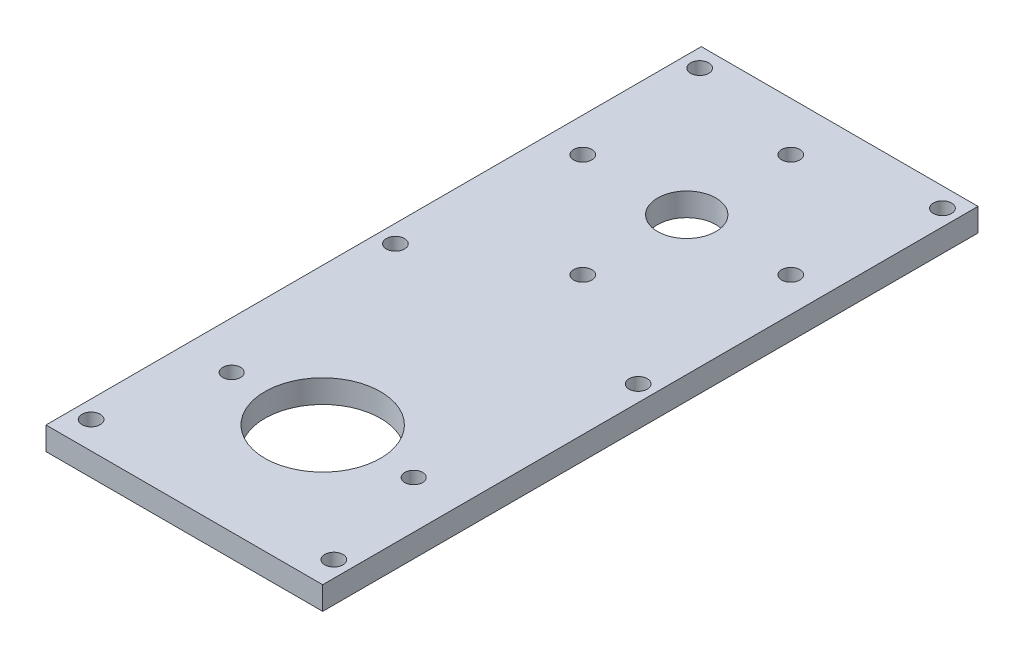
ISO-10303-21;
HEADER;
FILE_DESCRIPTION(('STEP AP214'),'2;1');
FILE_NAME('part.step','',(''),(''),'','','');
FILE_SCHEMA(('AUTOMOTIVE_DESIGN { 1 0 10303 214 1 1 1 1 }'));
ENDSEC;
DATA;
#1=APPLICATION_CONTEXT('core data for automotive mechanical design processes');
#2=APPLICATION_PROTOCOL_DEFINITION('international standard','automotive_design',2000,#1);
#3=PRODUCT_CONTEXT('',#1,'mechanical');
#4=PRODUCT('Part','Part','',(#3));
#5=PRODUCT_RELATED_PRODUCT_CATEGORY('part','',(#4));
#6=PRODUCT_DEFINITION_FORMATION('','',#4);
#7=PRODUCT_DEFINITION_CONTEXT('part definition',#1,'design');
#8=PRODUCT_DEFINITION('design','',#6,#7);
#9=PRODUCT_DEFINITION_SHAPE('','',#8);
#10=(LENGTH_UNIT() NAMED_UNIT(*) SI_UNIT(.MILLI.,.METRE.));
#11=(NAMED_UNIT(*) PLANE_ANGLE_UNIT() SI_UNIT($,.RADIAN.));
#12=(NAMED_UNIT(*) SI_UNIT($,.STERADIAN.) SOLID_ANGLE_UNIT());
#13=UNCERTAINTY_MEASURE_WITH_UNIT(LENGTH_MEASURE(1.E-05),#10,'distance_accuracy_value','');
#14=(GEOMETRIC_REPRESENTATION_CONTEXT(3) GLOBAL_UNCERTAINTY_ASSIGNED_CONTEXT((#13)) GLOBAL_UNIT_ASSIGNED_CONTEXT((#10,
#11,#12)) REPRESENTATION_CONTEXT('',''));
#15=CARTESIAN_POINT('',(0.,0.,0.));
#16=DIRECTION('',(0.,0.,1.));
#17=DIRECTION('',(1.,0.,0.));
#18=AXIS2_PLACEMENT_3D('',#15,#16,#17);
#19=CARTESIAN_POINT('',(-19.,3.175,0.));
#20=DIRECTION('',(1.,0.,0.));
#21=DIRECTION('',(0.,0.,-1.));
#22=AXIS2_PLACEMENT_3D('',#19,#20,#21);
#23=PLANE('',#22);
#24=DIRECTION('',(0.,0.,1.));
#25=VECTOR('',#24,1.);
#26=CARTESIAN_POINT('',(-19.,0.,0.));
#27=LINE('',#26,#25);
#28=CARTESIAN_POINT('',(-19.,0.,-71.));
#29=VERTEX_POINT('',#28);
#30=CARTESIAN_POINT('',(-19.,0.,19.));
#31=VERTEX_POINT('',#30);
#32=EDGE_CURVE('E144',#29,#31,#27,.T.);
#33=ORIENTED_EDGE('',*,*,#32,.T.);
#34=DIRECTION('',(0.,-1.,0.));
#35=VECTOR('',#34,1.);
#36=CARTESIAN_POINT('',(-19.,3.175,19.));
#37=LINE('',#36,#35);
#38=CARTESIAN_POINT('',(-19.,3.175,19.));
#39=VERTEX_POINT('',#38);
#40=EDGE_CURVE('E11',#39,#31,#37,.T.);
#41=ORIENTED_EDGE('',*,*,#40,.F.);
#42=DIRECTION('',(0.,0.,1.));
#43=VECTOR('',#42,1.);
#44=CARTESIAN_POINT('',(-19.,3.175,0.));
#45=LINE('',#44,#43);
#46=CARTESIAN_POINT('',(-19.,3.175,-71.));
#47=VERTEX_POINT('',#46);
#48=EDGE_CURVE('E90',#47,#39,#45,.T.);
#49=ORIENTED_EDGE('',*,*,#48,.F.);
#50=DIRECTION('',(0.,-1.,0.));
#51=VECTOR('',#50,1.);
#52=CARTESIAN_POINT('',(-19.,3.175,-71.));
#53=LINE('',#52,#51);
#54=EDGE_CURVE('E107',#47,#29,#53,.T.);
#55=ORIENTED_EDGE('',*,*,#54,.T.);
#56=EDGE_LOOP('',(#33,#41,#49,#55));
#57=FACE_BOUND('',#56,.T.);
#58=ADVANCED_FACE('F37',(#57),#23,.F.);
#59=CARTESIAN_POINT('',(0.,3.175,19.));
#60=DIRECTION('',(0.,0.,-1.));
#61=DIRECTION('',(-1.,0.,0.));
#62=AXIS2_PLACEMENT_3D('',#59,#60,#61);
#63=PLANE('',#62);
#64=DIRECTION('',(1.,0.,0.));
#65=VECTOR('',#64,1.);
#66=CARTESIAN_POINT('',(0.,0.,19.));
#67=LINE('',#66,#65);
#68=CARTESIAN_POINT('',(19.,0.,19.));
#69=VERTEX_POINT('',#68);
#70=EDGE_CURVE('E94',#31,#69,#67,.T.);
#71=ORIENTED_EDGE('',*,*,#70,.T.);
#72=DIRECTION('',(0.,-1.,0.));
#73=VECTOR('',#72,1.);
#74=CARTESIAN_POINT('',(19.,3.175,19.));
#75=LINE('',#74,#73);
#76=CARTESIAN_POINT('',(19.,3.175,19.));
#77=VERTEX_POINT('',#76);
#78=EDGE_CURVE('E46',#77,#69,#75,.T.);
#79=ORIENTED_EDGE('',*,*,#78,.F.);
#80=DIRECTION('',(1.,0.,0.));
#81=VECTOR('',#80,1.);
#82=CARTESIAN_POINT('',(0.,3.175,19.));
#83=LINE('',#82,#81);
#84=EDGE_CURVE('E84',#39,#77,#83,.T.);
#85=ORIENTED_EDGE('',*,*,#84,.F.);
#86=ORIENTED_EDGE('',*,*,#40,.T.);
#87=EDGE_LOOP('',(#71,#79,#85,#86));
#88=FACE_BOUND('',#87,.T.);
#89=ADVANCED_FACE('F93',(#88),#63,.F.);
#90=CARTESIAN_POINT('',(19.,3.175,0.));
#91=DIRECTION('',(-1.,0.,0.));
#92=DIRECTION('',(0.,0.,1.));
#93=AXIS2_PLACEMENT_3D('',#90,#91,#92);
#94=PLANE('',#93);
#95=DIRECTION('',(0.,0.,-1.));
#96=VECTOR('',#95,1.);
#97=CARTESIAN_POINT('',(19.,0.,0.));
#98=LINE('',#97,#96);
#99=CARTESIAN_POINT('',(19.,0.,-71.));
#100=VERTEX_POINT('',#99);
#101=EDGE_CURVE('E71',#69,#100,#98,.T.);
#102=ORIENTED_EDGE('',*,*,#101,.T.);
#103=DIRECTION('',(0.,-1.,0.));
#104=VECTOR('',#103,1.);
#105=CARTESIAN_POINT('',(19.,3.175,-71.));
#106=LINE('',#105,#104);
#107=CARTESIAN_POINT('',(19.,3.175,-71.));
#108=VERTEX_POINT('',#107);
#109=EDGE_CURVE('E95',#108,#100,#106,.T.);
#110=ORIENTED_EDGE('',*,*,#109,.F.);
#111=DIRECTION('',(0.,0.,-1.));
#112=VECTOR('',#111,1.);
#113=CARTESIAN_POINT('',(19.,3.175,0.));
#114=LINE('',#113,#112);
#115=EDGE_CURVE('E88',#77,#108,#114,.T.);
#116=ORIENTED_EDGE('',*,*,#115,.F.);
#117=ORIENTED_EDGE('',*,*,#78,.T.);
#118=EDGE_LOOP('',(#102,#110,#116,#117));
#119=FACE_BOUND('',#118,.T.);
#120=ADVANCED_FACE('F96',(#119),#94,.F.);
#121=CARTESIAN_POINT('',(-12.5,3.175,0.));
#122=DIRECTION('',(0.,-1.,0.));
#123=DIRECTION('',(0.,0.,-1.));
#124=AXIS2_PLACEMENT_3D('',#121,#122,#123);
#125=CYLINDRICAL_SURFACE('',#124,1.22);
#126=CARTESIAN_POINT('',(-12.5,3.175,0.));
#127=DIRECTION('',(0.,1.,0.));
#128=DIRECTION('',(0.,0.,1.));
#129=AXIS2_PLACEMENT_3D('',#126,#127,#128);
#130=CIRCLE('',#129,1.22);
#131=CARTESIAN_POINT('',(-12.5,3.175,1.22));
#132=VERTEX_POINT('',#131);
#133=EDGE_CURVE('E98',#132,#132,#130,.T.);
#134=ORIENTED_EDGE('',*,*,#133,.T.);
#135=EDGE_LOOP('',(#134));
#136=FACE_BOUND('',#135,.T.);
#137=CARTESIAN_POINT('',(-12.5,0.,0.));
#138=DIRECTION('',(0.,1.,0.));
#139=DIRECTION('',(0.,0.,1.));
#140=AXIS2_PLACEMENT_3D('',#137,#138,#139);
#141=CIRCLE('',#140,1.22);
#142=CARTESIAN_POINT('',(-12.5,0.,1.22));
#143=VERTEX_POINT('',#142);
#144=EDGE_CURVE('E150',#143,#143,#141,.T.);
#145=ORIENTED_EDGE('',*,*,#144,.F.);
#146=EDGE_LOOP('',(#145));
#147=FACE_BOUND('',#146,.T.);
#148=ADVANCED_FACE('F328',(#136,#147),#125,.F.);
#149=CARTESIAN_POINT('',(0.,3.175,-71.));
#150=DIRECTION('',(0.,0.,1.));
#151=DIRECTION('',(1.,0.,0.));
#152=AXIS2_PLACEMENT_3D('',#149,#150,#151);
#153=PLANE('',#152);
#154=DIRECTION('',(-1.,0.,0.));
#155=VECTOR('',#154,1.);
#156=CARTESIAN_POINT('',(0.,0.,-71.));
#157=LINE('',#156,#155);
#158=EDGE_CURVE('E77',#100,#29,#157,.T.);
#159=ORIENTED_EDGE('',*,*,#158,.T.);
#160=ORIENTED_EDGE('',*,*,#54,.F.);
#161=DIRECTION('',(-1.,0.,0.));
#162=VECTOR('',#161,1.);
#163=CARTESIAN_POINT('',(0.,3.175,-71.));
#164=LINE('',#163,#162);
#165=EDGE_CURVE('E54',#108,#47,#164,.T.);
#166=ORIENTED_EDGE('',*,*,#165,.F.);
#167=ORIENTED_EDGE('',*,*,#109,.T.);
#168=EDGE_LOOP('',(#159,#160,#166,#167));
#169=FACE_BOUND('',#168,.T.);
#170=ADVANCED_FACE('F158',(#169),#153,.F.);
#171=CARTESIAN_POINT('',(12.5,3.175,0.));
#172=DIRECTION('',(0.,-1.,0.));
#173=DIRECTION('',(0.,0.,-1.));
#174=AXIS2_PLACEMENT_3D('',#171,#172,#173);
#175=CYLINDRICAL_SURFACE('',#174,1.22);
#176=CARTESIAN_POINT('',(12.5,3.175,0.));
#177=DIRECTION('',(0.,1.,0.));
#178=DIRECTION('',(0.,0.,1.));
#179=AXIS2_PLACEMENT_3D('',#176,#177,#178);
#180=CIRCLE('',#179,1.22);
#181=CARTESIAN_POINT('',(12.5,3.175,1.22));
#182=VERTEX_POINT('',#181);
#183=EDGE_CURVE('E164',#182,#182,#180,.T.);
#184=ORIENTED_EDGE('',*,*,#183,.T.);
#185=EDGE_LOOP('',(#184));
#186=FACE_BOUND('',#185,.T.);
#187=CARTESIAN_POINT('',(12.5,0.,0.));
#188=DIRECTION('',(0.,1.,0.));
#189=DIRECTION('',(0.,0.,1.));
#190=AXIS2_PLACEMENT_3D('',#187,#188,#189);
#191=CIRCLE('',#190,1.22);
#192=CARTESIAN_POINT('',(12.5,0.,1.22));
#193=VERTEX_POINT('',#192);
#194=EDGE_CURVE('E141',#193,#193,#191,.T.);
#195=ORIENTED_EDGE('',*,*,#194,.F.);
#196=EDGE_LOOP('',(#195));
#197=FACE_BOUND('',#196,.T.);
#198=ADVANCED_FACE('F229',(#186,#197),#175,.F.);
#199=CARTESIAN_POINT('',(-14.2875,3.175,-50.));
#200=DIRECTION('',(0.,-1.,0.));
#201=DIRECTION('',(0.,0.,-1.));
#202=AXIS2_PLACEMENT_3D('',#199,#200,#201);
#203=CYLINDRICAL_SURFACE('',#202,1.25);
#204=CARTESIAN_POINT('',(-14.2875,3.175,-50.));
#205=DIRECTION('',(0.,1.,0.));
#206=DIRECTION('',(0.,0.,1.));
#207=AXIS2_PLACEMENT_3D('',#204,#205,#206);
#208=CIRCLE('',#207,1.25);
#209=CARTESIAN_POINT('',(-14.2875,3.175,-48.75));
#210=VERTEX_POINT('',#209);
#211=EDGE_CURVE('E166',#210,#210,#208,.T.);
#212=ORIENTED_EDGE('',*,*,#211,.T.);
#213=EDGE_LOOP('',(#212));
#214=FACE_BOUND('',#213,.T.);
#215=CARTESIAN_POINT('',(-14.2875,0.,-50.));
#216=DIRECTION('',(0.,1.,0.));
#217=DIRECTION('',(0.,0.,1.));
#218=AXIS2_PLACEMENT_3D('',#215,#216,#217);
#219=CIRCLE('',#218,1.25);
#220=CARTESIAN_POINT('',(-14.2875,0.,-48.75));
#221=VERTEX_POINT('',#220);
#222=EDGE_CURVE('E138',#221,#221,#219,.T.);
#223=ORIENTED_EDGE('',*,*,#222,.F.);
#224=EDGE_LOOP('',(#223));
#225=FACE_BOUND('',#224,.T.);
#226=ADVANCED_FACE('F232',(#214,#225),#203,.F.);
#227=CARTESIAN_POINT('',(16.7853152068389,3.175,15.2488594338536));
#228=DIRECTION('',(0.,-1.,0.));
#229=DIRECTION('',(0.,0.,-1.));
#230=AXIS2_PLACEMENT_3D('',#227,#228,#229);
#231=CYLINDRICAL_SURFACE('',#230,1.25);
#232=CARTESIAN_POINT('',(16.7853152068389,3.175,15.2488594338536));
#233=DIRECTION('',(0.,1.,0.));
#234=DIRECTION('',(0.,0.,1.));
#235=AXIS2_PLACEMENT_3D('',#232,#233,#234);
#236=CIRCLE('',#235,1.25);
#237=CARTESIAN_POINT('',(16.7853152068389,3.175,16.4988594338536));
#238=VERTEX_POINT('',#237);
#239=EDGE_CURVE('E171',#238,#238,#236,.T.);
#240=ORIENTED_EDGE('',*,*,#239,.T.);
#241=EDGE_LOOP('',(#240));
#242=FACE_BOUND('',#241,.T.);
#243=CARTESIAN_POINT('',(16.7853152068389,0.,15.2488594338536));
#244=DIRECTION('',(0.,1.,0.));
#245=DIRECTION('',(0.,0.,1.));
#246=AXIS2_PLACEMENT_3D('',#243,#244,#245);
#247=CIRCLE('',#246,1.25);
#248=CARTESIAN_POINT('',(16.7853152068389,0.,16.4988594338536));
#249=VERTEX_POINT('',#248);
#250=EDGE_CURVE('E135',#249,#249,#247,.T.);
#251=ORIENTED_EDGE('',*,*,#250,.F.);
#252=EDGE_LOOP('',(#251));
#253=FACE_BOUND('',#252,.T.);
#254=ADVANCED_FACE('F253',(#242,#253),#231,.F.);
#255=CARTESIAN_POINT('',(16.7853152068389,3.175,-26.5426249166438));
#256=DIRECTION('',(0.,-1.,0.));
#257=DIRECTION('',(0.,0.,-1.));
#258=AXIS2_PLACEMENT_3D('',#255,#256,#257);
#259=CYLINDRICAL_SURFACE('',#258,1.25);
#260=CARTESIAN_POINT('',(16.7853152068389,3.175,-26.5426249166438));
#261=DIRECTION('',(0.,1.,0.));
#262=DIRECTION('',(0.,0.,1.));
#263=AXIS2_PLACEMENT_3D('',#260,#261,#262);
#264=CIRCLE('',#263,1.25);
#265=CARTESIAN_POINT('',(16.7853152068389,3.175,-25.2926249166438));
#266=VERTEX_POINT('',#265);
#267=EDGE_CURVE('E174',#266,#266,#264,.T.);
#268=ORIENTED_EDGE('',*,*,#267,.T.);
#269=EDGE_LOOP('',(#268));
#270=FACE_BOUND('',#269,.T.);
#271=CARTESIAN_POINT('',(16.7853152068389,0.,-26.5426249166438));
#272=DIRECTION('',(0.,1.,0.));
#273=DIRECTION('',(0.,0.,1.));
#274=AXIS2_PLACEMENT_3D('',#271,#272,#273);
#275=CIRCLE('',#274,1.25);
#276=CARTESIAN_POINT('',(16.7853152068389,0.,-25.2926249166438));
#277=VERTEX_POINT('',#276);
#278=EDGE_CURVE('E132',#277,#277,#275,.T.);
#279=ORIENTED_EDGE('',*,*,#278,.F.);
#280=EDGE_LOOP('',(#279));
#281=FACE_BOUND('',#280,.T.);
#282=ADVANCED_FACE('F257',(#270,#281),#259,.F.);
#283=CARTESIAN_POINT('',(16.7853152068389,3.175,-68.3341092671412));
#284=DIRECTION('',(0.,-1.,0.));
#285=DIRECTION('',(0.,0.,-1.));
#286=AXIS2_PLACEMENT_3D('',#283,#284,#285);
#287=CYLINDRICAL_SURFACE('',#286,1.25);
#288=CARTESIAN_POINT('',(16.7853152068389,3.175,-68.3341092671412));
#289=DIRECTION('',(0.,1.,0.));
#290=DIRECTION('',(0.,0.,1.));
#291=AXIS2_PLACEMENT_3D('',#288,#289,#290);
#292=CIRCLE('',#291,1.25);
#293=CARTESIAN_POINT('',(16.7853152068389,3.175,-67.0841092671412));
#294=VERTEX_POINT('',#293);
#295=EDGE_CURVE('E177',#294,#294,#292,.T.);
#296=ORIENTED_EDGE('',*,*,#295,.T.);
#297=EDGE_LOOP('',(#296));
#298=FACE_BOUND('',#297,.T.);
#299=CARTESIAN_POINT('',(16.7853152068389,0.,-68.3341092671412));
#300=DIRECTION('',(0.,1.,0.));
#301=DIRECTION('',(0.,0.,1.));
#302=AXIS2_PLACEMENT_3D('',#299,#300,#301);
#303=CIRCLE('',#302,1.25);
#304=CARTESIAN_POINT('',(16.7853152068389,0.,-67.0841092671412));
#305=VERTEX_POINT('',#304);
#306=EDGE_CURVE('E129',#305,#305,#303,.T.);
#307=ORIENTED_EDGE('',*,*,#306,.F.);
#308=EDGE_LOOP('',(#307));
#309=FACE_BOUND('',#308,.T.);
#310=ADVANCED_FACE('F261',(#298,#309),#287,.F.);
#311=CARTESIAN_POINT('',(-16.5569953642972,3.175,-68.3341092671412));
#312=DIRECTION('',(0.,-1.,0.));
#313=DIRECTION('',(0.,0.,-1.));
#314=AXIS2_PLACEMENT_3D('',#311,#312,#313);
#315=CYLINDRICAL_SURFACE('',#314,1.25);
#316=CARTESIAN_POINT('',(-16.5569953642972,3.175,-68.3341092671412));
#317=DIRECTION('',(0.,1.,0.));
#318=DIRECTION('',(0.,0.,1.));
#319=AXIS2_PLACEMENT_3D('',#316,#317,#318);
#320=CIRCLE('',#319,1.25);
#321=CARTESIAN_POINT('',(-16.5569953642972,3.175,-67.0841092671412));
#322=VERTEX_POINT('',#321);
#323=EDGE_CURVE('E180',#322,#322,#320,.T.);
#324=ORIENTED_EDGE('',*,*,#323,.T.);
#325=EDGE_LOOP('',(#324));
#326=FACE_BOUND('',#325,.T.);
#327=CARTESIAN_POINT('',(-16.5569953642972,0.,-68.3341092671412));
#328=DIRECTION('',(0.,1.,0.));
#329=DIRECTION('',(0.,0.,1.));
#330=AXIS2_PLACEMENT_3D('',#327,#328,#329);
#331=CIRCLE('',#330,1.25);
#332=CARTESIAN_POINT('',(-16.5569953642972,0.,-67.0841092671412));
#333=VERTEX_POINT('',#332);
#334=EDGE_CURVE('E126',#333,#333,#331,.T.);
#335=ORIENTED_EDGE('',*,*,#334,.F.);
#336=EDGE_LOOP('',(#335));
#337=FACE_BOUND('',#336,.T.);
#338=ADVANCED_FACE('F265',(#326,#337),#315,.F.);
#339=CARTESIAN_POINT('',(-16.5569953642972,3.175,-26.5426249166438));
#340=DIRECTION('',(0.,-1.,0.));
#341=DIRECTION('',(0.,0.,-1.));
#342=AXIS2_PLACEMENT_3D('',#339,#340,#341);
#343=CYLINDRICAL_SURFACE('',#342,1.25);
#344=CARTESIAN_POINT('',(-16.5569953642972,3.175,-26.5426249166438));
#345=DIRECTION('',(0.,1.,0.));
#346=DIRECTION('',(0.,0.,1.));
#347=AXIS2_PLACEMENT_3D('',#344,#345,#346);
#348=CIRCLE('',#347,1.25);
#349=CARTESIAN_POINT('',(-16.5569953642972,3.175,-25.2926249166438));
#350=VERTEX_POINT('',#349);
#351=EDGE_CURVE('E183',#350,#350,#348,.T.);
#352=ORIENTED_EDGE('',*,*,#351,.T.);
#353=EDGE_LOOP('',(#352));
#354=FACE_BOUND('',#353,.T.);
#355=CARTESIAN_POINT('',(-16.5569953642972,0.,-26.5426249166438));
#356=DIRECTION('',(0.,1.,0.));
#357=DIRECTION('',(0.,0.,1.));
#358=AXIS2_PLACEMENT_3D('',#355,#356,#357);
#359=CIRCLE('',#358,1.25);
#360=CARTESIAN_POINT('',(-16.5569953642972,0.,-25.2926249166438));
#361=VERTEX_POINT('',#360);
#362=EDGE_CURVE('E123',#361,#361,#359,.T.);
#363=ORIENTED_EDGE('',*,*,#362,.F.);
#364=EDGE_LOOP('',(#363));
#365=FACE_BOUND('',#364,.T.);
#366=ADVANCED_FACE('F269',(#354,#365),#343,.F.);
#367=CARTESIAN_POINT('',(-16.5569953642972,3.175,15.2488594338536));
#368=DIRECTION('',(0.,-1.,0.));
#369=DIRECTION('',(0.,0.,-1.));
#370=AXIS2_PLACEMENT_3D('',#367,#368,#369);
#371=CYLINDRICAL_SURFACE('',#370,1.25);
#372=CARTESIAN_POINT('',(-16.5569953642972,3.175,15.2488594338536));
#373=DIRECTION('',(0.,1.,0.));
#374=DIRECTION('',(0.,0.,1.));
#375=AXIS2_PLACEMENT_3D('',#372,#373,#374);
#376=CIRCLE('',#375,1.25);
#377=CARTESIAN_POINT('',(-16.5569953642972,3.175,16.4988594338536));
#378=VERTEX_POINT('',#377);
#379=EDGE_CURVE('E186',#378,#378,#376,.T.);
#380=ORIENTED_EDGE('',*,*,#379,.T.);
#381=EDGE_LOOP('',(#380));
#382=FACE_BOUND('',#381,.T.);
#383=CARTESIAN_POINT('',(-16.5569953642972,0.,15.2488594338536));
#384=DIRECTION('',(0.,1.,0.));
#385=DIRECTION('',(0.,0.,1.));
#386=AXIS2_PLACEMENT_3D('',#383,#384,#385);
#387=CIRCLE('',#386,1.25);
#388=CARTESIAN_POINT('',(-16.5569953642972,0.,16.4988594338536));
#389=VERTEX_POINT('',#388);
#390=EDGE_CURVE('E120',#389,#389,#387,.T.);
#391=ORIENTED_EDGE('',*,*,#390,.F.);
#392=EDGE_LOOP('',(#391));
#393=FACE_BOUND('',#392,.T.);
#394=ADVANCED_FACE('F273',(#382,#393),#371,.F.);
#395=CARTESIAN_POINT('',(14.2875,3.175,-50.));
#396=DIRECTION('',(0.,-1.,0.));
#397=DIRECTION('',(0.,0.,-1.));
#398=AXIS2_PLACEMENT_3D('',#395,#396,#397);
#399=CYLINDRICAL_SURFACE('',#398,1.25);
#400=CARTESIAN_POINT('',(14.2875,3.175,-50.));
#401=DIRECTION('',(0.,1.,0.));
#402=DIRECTION('',(0.,0.,1.));
#403=AXIS2_PLACEMENT_3D('',#400,#401,#402);
#404=CIRCLE('',#403,1.25);
#405=CARTESIAN_POINT('',(14.2875,3.175,-48.75));
#406=VERTEX_POINT('',#405);
#407=EDGE_CURVE('E189',#406,#406,#404,.T.);
#408=ORIENTED_EDGE('',*,*,#407,.T.);
#409=EDGE_LOOP('',(#408));
#410=FACE_BOUND('',#409,.T.);
#411=CARTESIAN_POINT('',(14.2875,0.,-50.));
#412=DIRECTION('',(0.,1.,0.));
#413=DIRECTION('',(0.,0.,1.));
#414=AXIS2_PLACEMENT_3D('',#411,#412,#413);
#415=CIRCLE('',#414,1.25);
#416=CARTESIAN_POINT('',(14.2875,0.,-48.75));
#417=VERTEX_POINT('',#416);
#418=EDGE_CURVE('E117',#417,#417,#415,.T.);
#419=ORIENTED_EDGE('',*,*,#418,.F.);
#420=EDGE_LOOP('',(#419));
#421=FACE_BOUND('',#420,.T.);
#422=ADVANCED_FACE('F277',(#410,#421),#399,.F.);
#423=CARTESIAN_POINT('',(0.,3.175,-35.7125));
#424=DIRECTION('',(0.,-1.,0.));
#425=DIRECTION('',(0.,0.,-1.));
#426=AXIS2_PLACEMENT_3D('',#423,#424,#425);
#427=CYLINDRICAL_SURFACE('',#426,1.25);
#428=CARTESIAN_POINT('',(0.,3.175,-35.7125));
#429=DIRECTION('',(0.,1.,0.));
#430=DIRECTION('',(0.,0.,1.));
#431=AXIS2_PLACEMENT_3D('',#428,#429,#430);
#432=CIRCLE('',#431,1.25);
#433=CARTESIAN_POINT('',(0.,3.175,-34.4625));
#434=VERTEX_POINT('',#433);
#435=EDGE_CURVE('E192',#434,#434,#432,.T.);
#436=ORIENTED_EDGE('',*,*,#435,.T.);
#437=EDGE_LOOP('',(#436));
#438=FACE_BOUND('',#437,.T.);
#439=CARTESIAN_POINT('',(0.,0.,-35.7125));
#440=DIRECTION('',(0.,1.,0.));
#441=DIRECTION('',(0.,0.,1.));
#442=AXIS2_PLACEMENT_3D('',#439,#440,#441);
#443=CIRCLE('',#442,1.25);
#444=CARTESIAN_POINT('',(0.,0.,-34.4625));
#445=VERTEX_POINT('',#444);
#446=EDGE_CURVE('E114',#445,#445,#443,.T.);
#447=ORIENTED_EDGE('',*,*,#446,.F.);
#448=EDGE_LOOP('',(#447));
#449=FACE_BOUND('',#448,.T.);
#450=ADVANCED_FACE('F281',(#438,#449),#427,.F.);
#451=CARTESIAN_POINT('',(0.,3.175,-50.));
#452=DIRECTION('',(0.,-1.,0.));
#453=DIRECTION('',(0.,0.,-1.));
#454=AXIS2_PLACEMENT_3D('',#451,#452,#453);
#455=CYLINDRICAL_SURFACE('',#454,4.);
#456=CARTESIAN_POINT('',(0.,3.175,-50.));
#457=DIRECTION('',(0.,1.,0.));
#458=DIRECTION('',(0.,0.,1.));
#459=AXIS2_PLACEMENT_3D('',#456,#457,#458);
#460=CIRCLE('',#459,4.);
#461=CARTESIAN_POINT('',(0.,3.175,-46.));
#462=VERTEX_POINT('',#461);
#463=EDGE_CURVE('E195',#462,#462,#460,.T.);
#464=ORIENTED_EDGE('',*,*,#463,.T.);
#465=EDGE_LOOP('',(#464));
#466=FACE_BOUND('',#465,.T.);
#467=CARTESIAN_POINT('',(0.,0.,-50.));
#468=DIRECTION('',(0.,1.,0.));
#469=DIRECTION('',(0.,0.,1.));
#470=AXIS2_PLACEMENT_3D('',#467,#468,#469);
#471=CIRCLE('',#470,4.);
#472=CARTESIAN_POINT('',(0.,0.,-46.));
#473=VERTEX_POINT('',#472);
#474=EDGE_CURVE('E111',#473,#473,#471,.T.);
#475=ORIENTED_EDGE('',*,*,#474,.F.);
#476=EDGE_LOOP('',(#475));
#477=FACE_BOUND('',#476,.T.);
#478=ADVANCED_FACE('F284',(#466,#477),#455,.F.);
#479=CARTESIAN_POINT('',(0.,3.175,-64.2875));
#480=DIRECTION('',(0.,-1.,0.));
#481=DIRECTION('',(0.,0.,-1.));
#482=AXIS2_PLACEMENT_3D('',#479,#480,#481);
#483=CYLINDRICAL_SURFACE('',#482,1.25);
#484=CARTESIAN_POINT('',(0.,3.175,-64.2875));
#485=DIRECTION('',(0.,1.,0.));
#486=DIRECTION('',(0.,0.,1.));
#487=AXIS2_PLACEMENT_3D('',#484,#485,#486);
#488=CIRCLE('',#487,1.25);
#489=CARTESIAN_POINT('',(0.,3.175,-63.0375));
#490=VERTEX_POINT('',#489);
#491=EDGE_CURVE('E156',#490,#490,#488,.T.);
#492=ORIENTED_EDGE('',*,*,#491,.T.);
#493=EDGE_LOOP('',(#492));
#494=FACE_BOUND('',#493,.T.);
#495=CARTESIAN_POINT('',(0.,0.,-64.2875));
#496=DIRECTION('',(0.,1.,0.));
#497=DIRECTION('',(0.,0.,1.));
#498=AXIS2_PLACEMENT_3D('',#495,#496,#497);
#499=CIRCLE('',#498,1.25);
#500=CARTESIAN_POINT('',(0.,0.,-63.0375));
#501=VERTEX_POINT('',#500);
#502=EDGE_CURVE('E108',#501,#501,#499,.T.);
#503=ORIENTED_EDGE('',*,*,#502,.F.);
#504=EDGE_LOOP('',(#503));
#505=FACE_BOUND('',#504,.T.);
#506=ADVANCED_FACE('F39',(#494,#505),#483,.F.);
#507=CARTESIAN_POINT('',(0.,3.175,0.));
#508=DIRECTION('',(0.,-1.,0.));
#509=DIRECTION('',(0.,0.,-1.));
#510=AXIS2_PLACEMENT_3D('',#507,#508,#509);
#511=CYLINDRICAL_SURFACE('',#510,7.9375);
#512=CARTESIAN_POINT('',(0.,3.175,0.));
#513=DIRECTION('',(0.,1.,0.));
#514=DIRECTION('',(0.,0.,1.));
#515=AXIS2_PLACEMENT_3D('',#512,#513,#514);
#516=CIRCLE('',#515,7.9375);
#517=CARTESIAN_POINT('',(0.,3.175,7.9375));
#518=VERTEX_POINT('',#517);
#519=EDGE_CURVE('E104',#518,#518,#516,.T.);
#520=ORIENTED_EDGE('',*,*,#519,.T.);
#521=EDGE_LOOP('',(#520));
#522=FACE_BOUND('',#521,.T.);
#523=CARTESIAN_POINT('',(0.,0.,0.));
#524=DIRECTION('',(0.,1.,0.));
#525=DIRECTION('',(0.,0.,1.));
#526=AXIS2_PLACEMENT_3D('',#523,#524,#525);
#527=CIRCLE('',#526,7.9375);
#528=CARTESIAN_POINT('',(0.,0.,7.9375));
#529=VERTEX_POINT('',#528);
#530=EDGE_CURVE('E153',#529,#529,#527,.T.);
#531=ORIENTED_EDGE('',*,*,#530,.F.);
#532=EDGE_LOOP('',(#531));
#533=FACE_BOUND('',#532,.T.);
#534=ADVANCED_FACE('F205',(#522,#533),#511,.F.);
#535=CARTESIAN_POINT('',(0.,3.175,0.));
#536=DIRECTION('',(0.,1.,0.));
#537=DIRECTION('',(0.,0.,1.));
#538=AXIS2_PLACEMENT_3D('',#535,#536,#537);
#539=PLANE('',#538);
#540=ORIENTED_EDGE('',*,*,#491,.F.);
#541=EDGE_LOOP('',(#540));
#542=FACE_BOUND('',#541,.T.);
#543=ORIENTED_EDGE('',*,*,#463,.F.);
#544=EDGE_LOOP('',(#543));
#545=FACE_BOUND('',#544,.T.);
#546=ORIENTED_EDGE('',*,*,#435,.F.);
#547=EDGE_LOOP('',(#546));
#548=FACE_BOUND('',#547,.T.);
#549=ORIENTED_EDGE('',*,*,#407,.F.);
#550=EDGE_LOOP('',(#549));
#551=FACE_BOUND('',#550,.T.);
#552=ORIENTED_EDGE('',*,*,#379,.F.);
#553=EDGE_LOOP('',(#552));
#554=FACE_BOUND('',#553,.T.);
#555=ORIENTED_EDGE('',*,*,#351,.F.);
#556=EDGE_LOOP('',(#555));
#557=FACE_BOUND('',#556,.T.);
#558=ORIENTED_EDGE('',*,*,#323,.F.);
#559=EDGE_LOOP('',(#558));
#560=FACE_BOUND('',#559,.T.);
#561=ORIENTED_EDGE('',*,*,#295,.F.);
#562=EDGE_LOOP('',(#561));
#563=FACE_BOUND('',#562,.T.);
#564=ORIENTED_EDGE('',*,*,#267,.F.);
#565=EDGE_LOOP('',(#564));
#566=FACE_BOUND('',#565,.T.);
#567=ORIENTED_EDGE('',*,*,#239,.F.);
#568=EDGE_LOOP('',(#567));
#569=FACE_BOUND('',#568,.T.);
#570=ORIENTED_EDGE('',*,*,#211,.F.);
#571=EDGE_LOOP('',(#570));
#572=FACE_BOUND('',#571,.T.);
#573=ORIENTED_EDGE('',*,*,#183,.F.);
#574=EDGE_LOOP('',(#573));
#575=FACE_BOUND('',#574,.T.);
#576=ORIENTED_EDGE('',*,*,#48,.T.);
#577=ORIENTED_EDGE('',*,*,#84,.T.);
#578=ORIENTED_EDGE('',*,*,#115,.T.);
#579=ORIENTED_EDGE('',*,*,#165,.T.);
#580=EDGE_LOOP('',(#576,#577,#578,#579));
#581=FACE_BOUND('',#580,.T.);
#582=ORIENTED_EDGE('',*,*,#133,.F.);
#583=EDGE_LOOP('',(#582));
#584=FACE_BOUND('',#583,.T.);
#585=ORIENTED_EDGE('',*,*,#519,.F.);
#586=EDGE_LOOP('',(#585));
#587=FACE_BOUND('',#586,.T.);
#588=ADVANCED_FACE('F85',(#542,#545,#548,#551,#554,#557,#560,#563,#566,#569,#572,#575,#581,#584,
#587),#539,.T.);
#589=CARTESIAN_POINT('',(0.,0.,0.));
#590=DIRECTION('',(0.,1.,0.));
#591=DIRECTION('',(0.,0.,1.));
#592=AXIS2_PLACEMENT_3D('',#589,#590,#591);
#593=PLANE('',#592);
#594=ORIENTED_EDGE('',*,*,#502,.T.);
#595=EDGE_LOOP('',(#594));
#596=FACE_BOUND('',#595,.T.);
#597=ORIENTED_EDGE('',*,*,#474,.T.);
#598=EDGE_LOOP('',(#597));
#599=FACE_BOUND('',#598,.T.);
#600=ORIENTED_EDGE('',*,*,#446,.T.);
#601=EDGE_LOOP('',(#600));
#602=FACE_BOUND('',#601,.T.);
#603=ORIENTED_EDGE('',*,*,#418,.T.);
#604=EDGE_LOOP('',(#603));
#605=FACE_BOUND('',#604,.T.);
#606=ORIENTED_EDGE('',*,*,#390,.T.);
#607=EDGE_LOOP('',(#606));
#608=FACE_BOUND('',#607,.T.);
#609=ORIENTED_EDGE('',*,*,#362,.T.);
#610=EDGE_LOOP('',(#609));
#611=FACE_BOUND('',#610,.T.);
#612=ORIENTED_EDGE('',*,*,#334,.T.);
#613=EDGE_LOOP('',(#612));
#614=FACE_BOUND('',#613,.T.);
#615=ORIENTED_EDGE('',*,*,#306,.T.);
#616=EDGE_LOOP('',(#615));
#617=FACE_BOUND('',#616,.T.);
#618=ORIENTED_EDGE('',*,*,#278,.T.);
#619=EDGE_LOOP('',(#618));
#620=FACE_BOUND('',#619,.T.);
#621=ORIENTED_EDGE('',*,*,#250,.T.);
#622=EDGE_LOOP('',(#621));
#623=FACE_BOUND('',#622,.T.);
#624=ORIENTED_EDGE('',*,*,#222,.T.);
#625=EDGE_LOOP('',(#624));
#626=FACE_BOUND('',#625,.T.);
#627=ORIENTED_EDGE('',*,*,#194,.T.);
#628=EDGE_LOOP('',(#627));
#629=FACE_BOUND('',#628,.T.);
#630=ORIENTED_EDGE('',*,*,#32,.F.);
#631=ORIENTED_EDGE('',*,*,#158,.F.);
#632=ORIENTED_EDGE('',*,*,#101,.F.);
#633=ORIENTED_EDGE('',*,*,#70,.F.);
#634=EDGE_LOOP('',(#630,#631,#632,#633));
#635=FACE_BOUND('',#634,.T.);
#636=ORIENTED_EDGE('',*,*,#144,.T.);
#637=EDGE_LOOP('',(#636));
#638=FACE_BOUND('',#637,.T.);
#639=ORIENTED_EDGE('',*,*,#530,.T.);
#640=EDGE_LOOP('',(#639));
#641=FACE_BOUND('',#640,.T.);
#642=ADVANCED_FACE('F161',(#596,#599,#602,#605,#608,#611,#614,#617,#620,#623,#626,#629,#635,
#638,#641),#593,.F.);
#643=CLOSED_SHELL('',(#58,#89,#120,#148,#170,#198,#226,#254,#282,#310,#338,#366,#394,#422,#450,
#478,#506,#534,#588,#642));
#644=MANIFOLD_SOLID_BREP('B2',#643);
#645=ADVANCED_BREP_SHAPE_REPRESENTATION('',(#18,#644),#14);
#646=SHAPE_DEFINITION_REPRESENTATION(#9,#645);
ENDSEC;
END-ISO-10303-21;
